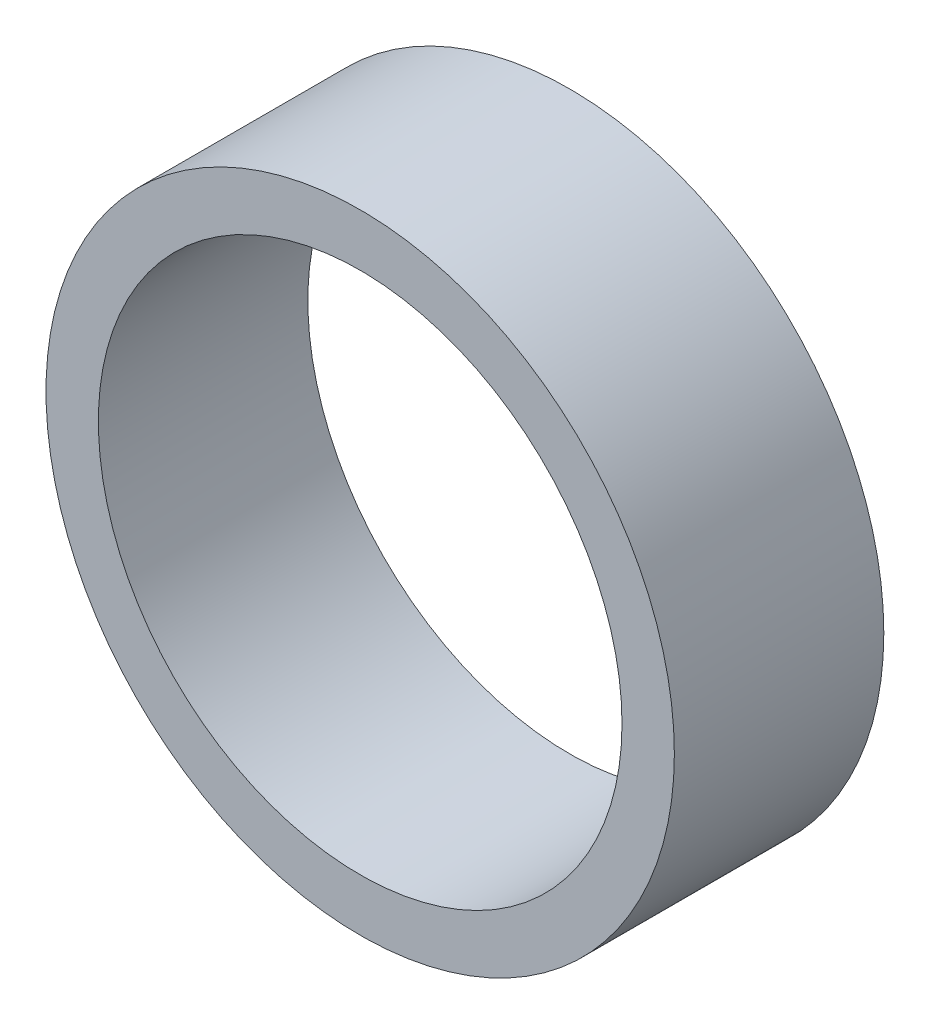
ISO-10303-21;
HEADER;
FILE_DESCRIPTION(('STEP AP214'),'2;1');
FILE_NAME('part.step','',(''),(''),'','','');
FILE_SCHEMA(('AUTOMOTIVE_DESIGN { 1 0 10303 214 1 1 1 1 }'));
ENDSEC;
DATA;
#1=APPLICATION_CONTEXT('core data for automotive mechanical design processes');
#2=APPLICATION_PROTOCOL_DEFINITION('international standard','automotive_design',2000,#1);
#3=PRODUCT_CONTEXT('',#1,'mechanical');
#4=PRODUCT('Part','Part','',(#3));
#5=PRODUCT_RELATED_PRODUCT_CATEGORY('part','',(#4));
#6=PRODUCT_DEFINITION_FORMATION('','',#4);
#7=PRODUCT_DEFINITION_CONTEXT('part definition',#1,'design');
#8=PRODUCT_DEFINITION('design','',#6,#7);
#9=PRODUCT_DEFINITION_SHAPE('','',#8);
#10=(LENGTH_UNIT() NAMED_UNIT(*) SI_UNIT(.MILLI.,.METRE.));
#11=(NAMED_UNIT(*) PLANE_ANGLE_UNIT() SI_UNIT($,.RADIAN.));
#12=(NAMED_UNIT(*) SI_UNIT($,.STERADIAN.) SOLID_ANGLE_UNIT());
#13=UNCERTAINTY_MEASURE_WITH_UNIT(LENGTH_MEASURE(1.E-05),#10,'distance_accuracy_value','');
#14=(GEOMETRIC_REPRESENTATION_CONTEXT(3) GLOBAL_UNCERTAINTY_ASSIGNED_CONTEXT((#13)) GLOBAL_UNIT_ASSIGNED_CONTEXT((#10,
#11,#12)) REPRESENTATION_CONTEXT('',''));
#15=CARTESIAN_POINT('',(0.,0.,0.));
#16=DIRECTION('',(0.,0.,1.));
#17=DIRECTION('',(1.,0.,0.));
#18=AXIS2_PLACEMENT_3D('',#15,#16,#17);
#19=CARTESIAN_POINT('',(0.,0.,2.));
#20=DIRECTION('',(0.,0.,1.));
#21=DIRECTION('',(1.,0.,0.));
#22=AXIS2_PLACEMENT_3D('',#19,#20,#21);
#23=PLANE('',#22);
#24=CARTESIAN_POINT('',(0.,0.,2.));
#25=DIRECTION('',(0.,0.,1.));
#26=DIRECTION('',(1.,0.,0.));
#27=AXIS2_PLACEMENT_3D('',#24,#25,#26);
#28=CIRCLE('',#27,3.);
#29=CARTESIAN_POINT('',(3.,0.,2.));
#30=VERTEX_POINT('',#29);
#31=EDGE_CURVE('E10',#30,#30,#28,.T.);
#32=ORIENTED_EDGE('',*,*,#31,.T.);
#33=EDGE_LOOP('',(#32));
#34=FACE_BOUND('',#33,.T.);
#35=CARTESIAN_POINT('',(0.,0.,2.));
#36=DIRECTION('',(0.,0.,1.));
#37=DIRECTION('',(1.,0.,0.));
#38=AXIS2_PLACEMENT_3D('',#35,#36,#37);
#39=CIRCLE('',#38,2.5);
#40=CARTESIAN_POINT('',(2.5,0.,2.));
#41=VERTEX_POINT('',#40);
#42=EDGE_CURVE('E56',#41,#41,#39,.T.);
#43=ORIENTED_EDGE('',*,*,#42,.F.);
#44=EDGE_LOOP('',(#43));
#45=FACE_BOUND('',#44,.T.);
#46=ADVANCED_FACE('F43',(#34,#45),#23,.T.);
#47=CARTESIAN_POINT('',(0.,0.,0.));
#48=DIRECTION('',(0.,0.,1.));
#49=DIRECTION('',(1.,0.,0.));
#50=AXIS2_PLACEMENT_3D('',#47,#48,#49);
#51=PLANE('',#50);
#52=CARTESIAN_POINT('',(0.,0.,0.));
#53=DIRECTION('',(0.,0.,1.));
#54=DIRECTION('',(1.,0.,0.));
#55=AXIS2_PLACEMENT_3D('',#52,#53,#54);
#56=CIRCLE('',#55,3.);
#57=CARTESIAN_POINT('',(3.,0.,0.));
#58=VERTEX_POINT('',#57);
#59=EDGE_CURVE('E47',#58,#58,#56,.T.);
#60=ORIENTED_EDGE('',*,*,#59,.F.);
#61=EDGE_LOOP('',(#60));
#62=FACE_BOUND('',#61,.T.);
#63=CARTESIAN_POINT('',(0.,0.,0.));
#64=DIRECTION('',(0.,0.,1.));
#65=DIRECTION('',(1.,0.,0.));
#66=AXIS2_PLACEMENT_3D('',#63,#64,#65);
#67=CIRCLE('',#66,2.5);
#68=CARTESIAN_POINT('',(2.5,0.,0.));
#69=VERTEX_POINT('',#68);
#70=EDGE_CURVE('E58',#69,#69,#67,.T.);
#71=ORIENTED_EDGE('',*,*,#70,.T.);
#72=EDGE_LOOP('',(#71));
#73=FACE_BOUND('',#72,.T.);
#74=ADVANCED_FACE('F70',(#62,#73),#51,.F.);
#75=CARTESIAN_POINT('',(0.,0.,2.));
#76=DIRECTION('',(0.,0.,-1.));
#77=DIRECTION('',(-1.,0.,0.));
#78=AXIS2_PLACEMENT_3D('',#75,#76,#77);
#79=CYLINDRICAL_SURFACE('',#78,3.);
#80=ORIENTED_EDGE('',*,*,#31,.F.);
#81=EDGE_LOOP('',(#80));
#82=FACE_BOUND('',#81,.T.);
#83=ORIENTED_EDGE('',*,*,#59,.T.);
#84=EDGE_LOOP('',(#83));
#85=FACE_BOUND('',#84,.T.);
#86=ADVANCED_FACE('F45',(#82,#85),#79,.T.);
#87=CARTESIAN_POINT('',(0.,0.,2.));
#88=DIRECTION('',(0.,0.,-1.));
#89=DIRECTION('',(-1.,0.,0.));
#90=AXIS2_PLACEMENT_3D('',#87,#88,#89);
#91=CYLINDRICAL_SURFACE('',#90,2.5);
#92=ORIENTED_EDGE('',*,*,#42,.T.);
#93=EDGE_LOOP('',(#92));
#94=FACE_BOUND('',#93,.T.);
#95=ORIENTED_EDGE('',*,*,#70,.F.);
#96=EDGE_LOOP('',(#95));
#97=FACE_BOUND('',#96,.T.);
#98=ADVANCED_FACE('F66',(#94,#97),#91,.F.);
#99=CLOSED_SHELL('',(#46,#74,#86,#98));
#100=MANIFOLD_SOLID_BREP('B2',#99);
#101=ADVANCED_BREP_SHAPE_REPRESENTATION('',(#18,#100),#14);
#102=SHAPE_DEFINITION_REPRESENTATION(#9,#101);
ENDSEC;
END-ISO-10303-21;
